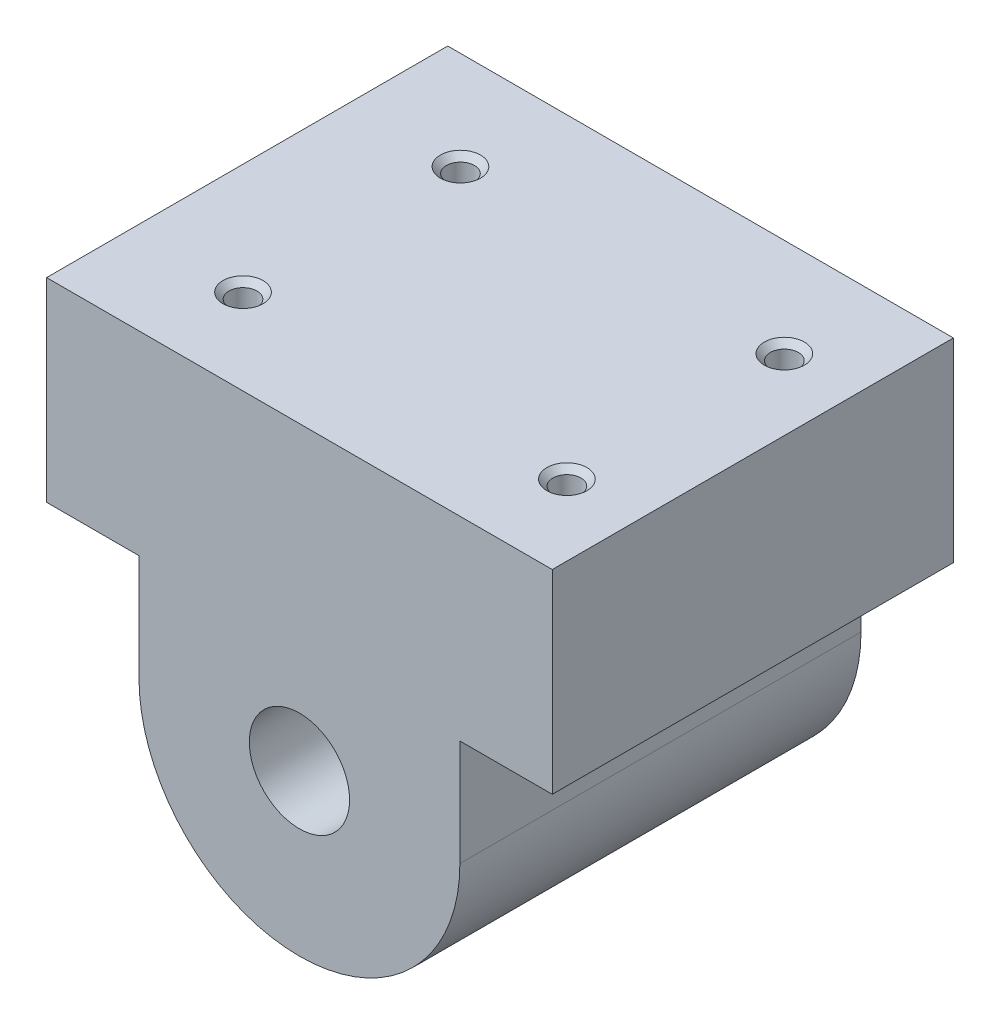
ISO-10303-21;
HEADER;
FILE_DESCRIPTION(('STEP AP214'),'2;1');
FILE_NAME('part.step','',(''),(''),'','','');
FILE_SCHEMA(('AUTOMOTIVE_DESIGN { 1 0 10303 214 1 1 1 1 }'));
ENDSEC;
DATA;
#1=APPLICATION_CONTEXT('core data for automotive mechanical design processes');
#2=APPLICATION_PROTOCOL_DEFINITION('international standard','automotive_design',2000,#1);
#3=PRODUCT_CONTEXT('',#1,'mechanical');
#4=PRODUCT('Part','Part','',(#3));
#5=PRODUCT_RELATED_PRODUCT_CATEGORY('part','',(#4));
#6=PRODUCT_DEFINITION_FORMATION('','',#4);
#7=PRODUCT_DEFINITION_CONTEXT('part definition',#1,'design');
#8=PRODUCT_DEFINITION('design','',#6,#7);
#9=PRODUCT_DEFINITION_SHAPE('','',#8);
#10=(LENGTH_UNIT() NAMED_UNIT(*) SI_UNIT(.MILLI.,.METRE.));
#11=(NAMED_UNIT(*) PLANE_ANGLE_UNIT() SI_UNIT($,.RADIAN.));
#12=(NAMED_UNIT(*) SI_UNIT($,.STERADIAN.) SOLID_ANGLE_UNIT());
#13=UNCERTAINTY_MEASURE_WITH_UNIT(LENGTH_MEASURE(1.E-05),#10,'distance_accuracy_value','');
#14=(GEOMETRIC_REPRESENTATION_CONTEXT(3) GLOBAL_UNCERTAINTY_ASSIGNED_CONTEXT((#13)) GLOBAL_UNIT_ASSIGNED_CONTEXT((#10,
#11,#12)) REPRESENTATION_CONTEXT('',''));
#15=CARTESIAN_POINT('',(0.,0.,0.));
#16=DIRECTION('',(0.,0.,1.));
#17=DIRECTION('',(1.,0.,0.));
#18=AXIS2_PLACEMENT_3D('',#15,#16,#17);
#19=CARTESIAN_POINT('',(-80.0000000362782,150.,-100.));
#20=DIRECTION('',(-1.,0.,0.));
#21=DIRECTION('',(0.,-1.,0.));
#22=AXIS2_PLACEMENT_3D('',#19,#20,#21);
#23=PLANE('',#22);
#24=DIRECTION('',(0.,-1.,0.));
#25=VECTOR('',#24,1.);
#26=CARTESIAN_POINT('',(-80.0000000362782,150.,100.));
#27=LINE('',#26,#25);
#28=CARTESIAN_POINT('',(-80.0000000362782,52.942582361,100.));
#29=VERTEX_POINT('',#28);
#30=CARTESIAN_POINT('',(-80.0000000362782,0.,100.));
#31=VERTEX_POINT('',#30);
#32=EDGE_CURVE('E69',#29,#31,#27,.T.);
#33=ORIENTED_EDGE('',*,*,#32,.F.);
#34=DIRECTION('',(0.,0.,1.));
#35=VECTOR('',#34,1.);
#36=CARTESIAN_POINT('',(-80.0000000362782,52.942582361,100.));
#37=LINE('',#36,#35);
#38=CARTESIAN_POINT('',(-80.0000000362782,52.942582361,-100.));
#39=VERTEX_POINT('',#38);
#40=EDGE_CURVE('E186',#39,#29,#37,.T.);
#41=ORIENTED_EDGE('',*,*,#40,.F.);
#42=DIRECTION('',(0.,-1.,0.));
#43=VECTOR('',#42,1.);
#44=CARTESIAN_POINT('',(-80.0000000362782,150.,-100.));
#45=LINE('',#44,#43);
#46=CARTESIAN_POINT('',(-80.0000000362782,0.,-100.));
#47=VERTEX_POINT('',#46);
#48=EDGE_CURVE('E57',#39,#47,#45,.T.);
#49=ORIENTED_EDGE('',*,*,#48,.T.);
#50=DIRECTION('',(0.,0.,1.));
#51=VECTOR('',#50,1.);
#52=CARTESIAN_POINT('',(-80.0000000362782,0.,-100.));
#53=LINE('',#52,#51);
#54=EDGE_CURVE('E77',#47,#31,#53,.T.);
#55=ORIENTED_EDGE('',*,*,#54,.T.);
#56=EDGE_LOOP('',(#33,#41,#49,#55));
#57=FACE_BOUND('',#56,.T.);
#58=ADVANCED_FACE('F33',(#57),#23,.T.);
#59=CARTESIAN_POINT('',(80.0000000362782,0.,-100.));
#60=DIRECTION('',(1.,0.,0.));
#61=DIRECTION('',(0.,1.,0.));
#62=AXIS2_PLACEMENT_3D('',#59,#60,#61);
#63=PLANE('',#62);
#64=DIRECTION('',(0.,1.,0.));
#65=VECTOR('',#64,1.);
#66=CARTESIAN_POINT('',(80.0000000362782,0.,-100.));
#67=LINE('',#66,#65);
#68=CARTESIAN_POINT('',(80.0000000362782,0.,-100.));
#69=VERTEX_POINT('',#68);
#70=CARTESIAN_POINT('',(80.0000000362782,52.9425823242566,-100.));
#71=VERTEX_POINT('',#70);
#72=EDGE_CURVE('E222',#69,#71,#67,.T.);
#73=ORIENTED_EDGE('',*,*,#72,.T.);
#74=DIRECTION('',(0.,0.,-1.));
#75=VECTOR('',#74,1.);
#76=CARTESIAN_POINT('',(80.0000000362782,52.9425823242566,-100.));
#77=LINE('',#76,#75);
#78=CARTESIAN_POINT('',(80.0000000362782,52.9425823242566,100.));
#79=VERTEX_POINT('',#78);
#80=EDGE_CURVE('E204',#79,#71,#77,.T.);
#81=ORIENTED_EDGE('',*,*,#80,.F.);
#82=DIRECTION('',(0.,1.,0.));
#83=VECTOR('',#82,1.);
#84=CARTESIAN_POINT('',(80.0000000362782,0.,100.));
#85=LINE('',#84,#83);
#86=CARTESIAN_POINT('',(80.0000000362782,0.,100.));
#87=VERTEX_POINT('',#86);
#88=EDGE_CURVE('E86',#87,#79,#85,.T.);
#89=ORIENTED_EDGE('',*,*,#88,.F.);
#90=DIRECTION('',(0.,0.,1.));
#91=VECTOR('',#90,1.);
#92=CARTESIAN_POINT('',(80.0000000362782,0.,-100.));
#93=LINE('',#92,#91);
#94=EDGE_CURVE('E82',#69,#87,#93,.T.);
#95=ORIENTED_EDGE('',*,*,#94,.F.);
#96=EDGE_LOOP('',(#73,#81,#89,#95));
#97=FACE_BOUND('',#96,.T.);
#98=ADVANCED_FACE('F135',(#97),#63,.T.);
#99=CARTESIAN_POINT('',(0.,0.,-100.));
#100=DIRECTION('',(0.,0.,1.));
#101=DIRECTION('',(1.,0.,0.));
#102=AXIS2_PLACEMENT_3D('',#99,#100,#101);
#103=CYLINDRICAL_SURFACE('',#102,80.0000000362782);
#104=CARTESIAN_POINT('',(0.,0.,100.));
#105=DIRECTION('',(0.,0.,1.));
#106=DIRECTION('',(1.,0.,0.));
#107=AXIS2_PLACEMENT_3D('',#104,#105,#106);
#108=CIRCLE('',#107,80.0000000362782);
#109=EDGE_CURVE('E73',#31,#87,#108,.T.);
#110=ORIENTED_EDGE('',*,*,#109,.F.);
#111=ORIENTED_EDGE('',*,*,#54,.F.);
#112=CARTESIAN_POINT('',(0.,0.,-100.));
#113=DIRECTION('',(0.,0.,1.));
#114=DIRECTION('',(1.,0.,0.));
#115=AXIS2_PLACEMENT_3D('',#112,#113,#114);
#116=CIRCLE('',#115,80.0000000362782);
#117=EDGE_CURVE('E74',#47,#69,#116,.T.);
#118=ORIENTED_EDGE('',*,*,#117,.T.);
#119=ORIENTED_EDGE('',*,*,#94,.T.);
#120=EDGE_LOOP('',(#110,#111,#118,#119));
#121=FACE_BOUND('',#120,.T.);
#122=ADVANCED_FACE('F84',(#121),#103,.T.);
#123=CARTESIAN_POINT('',(80.0000000362782,150.,-100.));
#124=DIRECTION('',(0.,1.,0.));
#125=DIRECTION('',(0.,0.,1.));
#126=AXIS2_PLACEMENT_3D('',#123,#124,#125);
#127=PLANE('',#126);
#128=CARTESIAN_POINT('',(90.685157882,150.,-51.091167344));
#129=DIRECTION('',(0.,1.,0.));
#130=DIRECTION('',(0.,0.,1.));
#131=AXIS2_PLACEMENT_3D('',#128,#129,#130);
#132=CIRCLE('',#131,10.);
#133=CARTESIAN_POINT('',(90.685157882,150.,-41.091167344));
#134=VERTEX_POINT('',#133);
#135=EDGE_CURVE('E110',#134,#134,#132,.F.);
#136=ORIENTED_EDGE('',*,*,#135,.T.);
#137=EDGE_LOOP('',(#136));
#138=FACE_BOUND('',#137,.T.);
#139=CARTESIAN_POINT('',(90.685157882,150.,57.320629237));
#140=DIRECTION('',(0.,1.,0.));
#141=DIRECTION('',(0.,0.,1.));
#142=AXIS2_PLACEMENT_3D('',#139,#140,#141);
#143=CIRCLE('',#142,10.);
#144=CARTESIAN_POINT('',(90.685157882,150.,67.320629237));
#145=VERTEX_POINT('',#144);
#146=EDGE_CURVE('E107',#145,#145,#143,.F.);
#147=ORIENTED_EDGE('',*,*,#146,.T.);
#148=EDGE_LOOP('',(#147));
#149=FACE_BOUND('',#148,.T.);
#150=CARTESIAN_POINT('',(-70.811035645,150.,-51.091167344));
#151=DIRECTION('',(0.,1.,0.));
#152=DIRECTION('',(0.,0.,1.));
#153=AXIS2_PLACEMENT_3D('',#150,#151,#152);
#154=CIRCLE('',#153,10.);
#155=CARTESIAN_POINT('',(-70.811035645,150.,-41.091167344));
#156=VERTEX_POINT('',#155);
#157=EDGE_CURVE('E104',#156,#156,#154,.F.);
#158=ORIENTED_EDGE('',*,*,#157,.T.);
#159=EDGE_LOOP('',(#158));
#160=FACE_BOUND('',#159,.T.);
#161=CARTESIAN_POINT('',(-70.811035645,150.,57.320629237));
#162=DIRECTION('',(0.,1.,0.));
#163=DIRECTION('',(0.,0.,1.));
#164=AXIS2_PLACEMENT_3D('',#161,#162,#163);
#165=CIRCLE('',#164,10.);
#166=CARTESIAN_POINT('',(-70.811035645,150.,67.320629237));
#167=VERTEX_POINT('',#166);
#168=EDGE_CURVE('E101',#167,#167,#165,.F.);
#169=ORIENTED_EDGE('',*,*,#168,.T.);
#170=EDGE_LOOP('',(#169));
#171=FACE_BOUND('',#170,.T.);
#172=DIRECTION('',(-1.,0.,0.));
#173=VECTOR('',#172,1.);
#174=CARTESIAN_POINT('',(80.0000000362782,150.,100.));
#175=LINE('',#174,#173);
#176=CARTESIAN_POINT('',(126.061398121278,149.999999980652,100.));
#177=VERTEX_POINT('',#176);
#178=CARTESIAN_POINT('',(-126.061398085,150.,100.));
#179=VERTEX_POINT('',#178);
#180=EDGE_CURVE('E75',#177,#179,#175,.T.);
#181=ORIENTED_EDGE('',*,*,#180,.F.);
#182=DIRECTION('',(0.,0.,1.));
#183=VECTOR('',#182,1.);
#184=CARTESIAN_POINT('',(126.061398121278,149.999999980652,100.));
#185=LINE('',#184,#183);
#186=CARTESIAN_POINT('',(126.061398121278,149.999999980652,-100.));
#187=VERTEX_POINT('',#186);
#188=EDGE_CURVE('E214',#187,#177,#185,.T.);
#189=ORIENTED_EDGE('',*,*,#188,.F.);
#190=DIRECTION('',(-1.,0.,0.));
#191=VECTOR('',#190,1.);
#192=CARTESIAN_POINT('',(80.0000000362782,150.,-100.));
#193=LINE('',#192,#191);
#194=CARTESIAN_POINT('',(-126.061398085,150.,-100.));
#195=VERTEX_POINT('',#194);
#196=EDGE_CURVE('E224',#187,#195,#193,.T.);
#197=ORIENTED_EDGE('',*,*,#196,.T.);
#198=DIRECTION('',(0.,0.,-1.));
#199=VECTOR('',#198,1.);
#200=CARTESIAN_POINT('',(-126.061398085,150.,-100.));
#201=LINE('',#200,#199);
#202=EDGE_CURVE('E190',#179,#195,#201,.T.);
#203=ORIENTED_EDGE('',*,*,#202,.F.);
#204=EDGE_LOOP('',(#181,#189,#197,#203));
#205=FACE_BOUND('',#204,.T.);
#206=ADVANCED_FACE('F145',(#138,#149,#160,#171,#205),#127,.T.);
#207=CARTESIAN_POINT('',(0.,0.,-100.));
#208=DIRECTION('',(0.,0.,1.));
#209=DIRECTION('',(1.,0.,0.));
#210=AXIS2_PLACEMENT_3D('',#207,#208,#209);
#211=PLANE('',#210);
#212=CARTESIAN_POINT('',(0.,0.,-100.));
#213=DIRECTION('',(0.,0.,1.));
#214=DIRECTION('',(1.,0.,0.));
#215=AXIS2_PLACEMENT_3D('',#212,#213,#214);
#216=CIRCLE('',#215,25.);
#217=CARTESIAN_POINT('',(25.,0.,-100.));
#218=VERTEX_POINT('',#217);
#219=EDGE_CURVE('E177',#218,#218,#216,.T.);
#220=ORIENTED_EDGE('',*,*,#219,.T.);
#221=EDGE_LOOP('',(#220));
#222=FACE_BOUND('',#221,.T.);
#223=ORIENTED_EDGE('',*,*,#117,.F.);
#224=ORIENTED_EDGE('',*,*,#48,.F.);
#225=DIRECTION('',(1.,0.,0.));
#226=VECTOR('',#225,1.);
#227=CARTESIAN_POINT('',(-126.061398085,52.942582361,-100.));
#228=LINE('',#227,#226);
#229=CARTESIAN_POINT('',(-126.061398085,52.942582361,-100.));
#230=VERTEX_POINT('',#229);
#231=EDGE_CURVE('E201',#230,#39,#228,.T.);
#232=ORIENTED_EDGE('',*,*,#231,.F.);
#233=DIRECTION('',(0.,-1.,0.));
#234=VECTOR('',#233,1.);
#235=CARTESIAN_POINT('',(-126.061398085,52.942582361,-100.));
#236=LINE('',#235,#234);
#237=EDGE_CURVE('E193',#195,#230,#236,.T.);
#238=ORIENTED_EDGE('',*,*,#237,.F.);
#239=ORIENTED_EDGE('',*,*,#196,.F.);
#240=DIRECTION('',(0.,1.,0.));
#241=VECTOR('',#240,1.);
#242=CARTESIAN_POINT('',(126.061398121278,149.999999980652,-100.));
#243=LINE('',#242,#241);
#244=CARTESIAN_POINT('',(126.061398121278,52.9425823242566,-100.));
#245=VERTEX_POINT('',#244);
#246=EDGE_CURVE('E211',#245,#187,#243,.T.);
#247=ORIENTED_EDGE('',*,*,#246,.F.);
#248=DIRECTION('',(-1.,0.,0.));
#249=VECTOR('',#248,1.);
#250=CARTESIAN_POINT('',(126.061398121278,52.9425823242566,-100.));
#251=LINE('',#250,#249);
#252=EDGE_CURVE('E91',#245,#71,#251,.T.);
#253=ORIENTED_EDGE('',*,*,#252,.T.);
#254=ORIENTED_EDGE('',*,*,#72,.F.);
#255=EDGE_LOOP('',(#223,#224,#232,#238,#239,#247,#253,#254));
#256=FACE_BOUND('',#255,.T.);
#257=ADVANCED_FACE('F147',(#222,#256),#211,.F.);
#258=CARTESIAN_POINT('',(0.,0.,100.));
#259=DIRECTION('',(0.,0.,1.));
#260=DIRECTION('',(1.,0.,0.));
#261=AXIS2_PLACEMENT_3D('',#258,#259,#260);
#262=PLANE('',#261);
#263=CARTESIAN_POINT('',(0.,0.,100.));
#264=DIRECTION('',(0.,0.,1.));
#265=DIRECTION('',(1.,0.,0.));
#266=AXIS2_PLACEMENT_3D('',#263,#264,#265);
#267=CIRCLE('',#266,25.);
#268=CARTESIAN_POINT('',(25.,0.,100.));
#269=VERTEX_POINT('',#268);
#270=EDGE_CURVE('E173',#269,#269,#267,.T.);
#271=ORIENTED_EDGE('',*,*,#270,.F.);
#272=EDGE_LOOP('',(#271));
#273=FACE_BOUND('',#272,.T.);
#274=ORIENTED_EDGE('',*,*,#109,.T.);
#275=ORIENTED_EDGE('',*,*,#88,.T.);
#276=DIRECTION('',(-1.,0.,0.));
#277=VECTOR('',#276,1.);
#278=CARTESIAN_POINT('',(126.061398121278,52.9425823242566,100.));
#279=LINE('',#278,#277);
#280=CARTESIAN_POINT('',(126.061398121278,52.9425823242566,100.));
#281=VERTEX_POINT('',#280);
#282=EDGE_CURVE('E87',#281,#79,#279,.T.);
#283=ORIENTED_EDGE('',*,*,#282,.F.);
#284=DIRECTION('',(0.,-1.,0.));
#285=VECTOR('',#284,1.);
#286=CARTESIAN_POINT('',(126.061398121278,52.9425823242566,100.));
#287=LINE('',#286,#285);
#288=EDGE_CURVE('E205',#177,#281,#287,.T.);
#289=ORIENTED_EDGE('',*,*,#288,.F.);
#290=ORIENTED_EDGE('',*,*,#180,.T.);
#291=DIRECTION('',(0.,1.,0.));
#292=VECTOR('',#291,1.);
#293=CARTESIAN_POINT('',(-126.061398085,150.,100.));
#294=LINE('',#293,#292);
#295=CARTESIAN_POINT('',(-126.061398085,52.942582361,100.));
#296=VERTEX_POINT('',#295);
#297=EDGE_CURVE('E187',#296,#179,#294,.T.);
#298=ORIENTED_EDGE('',*,*,#297,.F.);
#299=DIRECTION('',(1.,0.,0.));
#300=VECTOR('',#299,1.);
#301=CARTESIAN_POINT('',(-126.061398085,52.942582361,100.));
#302=LINE('',#301,#300);
#303=EDGE_CURVE('E48',#296,#29,#302,.T.);
#304=ORIENTED_EDGE('',*,*,#303,.T.);
#305=ORIENTED_EDGE('',*,*,#32,.T.);
#306=EDGE_LOOP('',(#274,#275,#283,#289,#290,#298,#304,#305));
#307=FACE_BOUND('',#306,.T.);
#308=ADVANCED_FACE('F70',(#273,#307),#262,.T.);
#309=CARTESIAN_POINT('',(126.061398121278,52.9425823242566,-100.));
#310=DIRECTION('',(0.,1.,0.));
#311=DIRECTION('',(-1.,0.,0.));
#312=AXIS2_PLACEMENT_3D('',#309,#310,#311);
#313=PLANE('',#312);
#314=ORIENTED_EDGE('',*,*,#80,.T.);
#315=ORIENTED_EDGE('',*,*,#252,.F.);
#316=DIRECTION('',(0.,0.,-1.));
#317=VECTOR('',#316,1.);
#318=CARTESIAN_POINT('',(126.061398121278,52.9425823242566,-100.));
#319=LINE('',#318,#317);
#320=EDGE_CURVE('E208',#281,#245,#319,.T.);
#321=ORIENTED_EDGE('',*,*,#320,.F.);
#322=ORIENTED_EDGE('',*,*,#282,.T.);
#323=EDGE_LOOP('',(#314,#315,#321,#322));
#324=FACE_BOUND('',#323,.T.);
#325=ADVANCED_FACE('F264',(#324),#313,.F.);
#326=CARTESIAN_POINT('',(126.061398121278,0.,0.));
#327=DIRECTION('',(-1.,0.,0.));
#328=DIRECTION('',(0.,-1.,0.));
#329=AXIS2_PLACEMENT_3D('',#326,#327,#328);
#330=PLANE('',#329);
#331=ORIENTED_EDGE('',*,*,#288,.T.);
#332=ORIENTED_EDGE('',*,*,#320,.T.);
#333=ORIENTED_EDGE('',*,*,#246,.T.);
#334=ORIENTED_EDGE('',*,*,#188,.T.);
#335=EDGE_LOOP('',(#331,#332,#333,#334));
#336=FACE_BOUND('',#335,.T.);
#337=ADVANCED_FACE('F269',(#336),#330,.F.);
#338=CARTESIAN_POINT('',(-126.061398085,52.942582361,100.));
#339=DIRECTION('',(0.,1.,0.));
#340=DIRECTION('',(0.,0.,1.));
#341=AXIS2_PLACEMENT_3D('',#338,#339,#340);
#342=PLANE('',#341);
#343=ORIENTED_EDGE('',*,*,#40,.T.);
#344=ORIENTED_EDGE('',*,*,#303,.F.);
#345=DIRECTION('',(0.,0.,1.));
#346=VECTOR('',#345,1.);
#347=CARTESIAN_POINT('',(-126.061398085,52.942582361,100.));
#348=LINE('',#347,#346);
#349=EDGE_CURVE('E196',#230,#296,#348,.T.);
#350=ORIENTED_EDGE('',*,*,#349,.F.);
#351=ORIENTED_EDGE('',*,*,#231,.T.);
#352=EDGE_LOOP('',(#343,#344,#350,#351));
#353=FACE_BOUND('',#352,.T.);
#354=ADVANCED_FACE('F247',(#353),#342,.F.);
#355=CARTESIAN_POINT('',(-126.061398085,0.,0.));
#356=DIRECTION('',(1.,0.,0.));
#357=DIRECTION('',(0.,0.,-1.));
#358=AXIS2_PLACEMENT_3D('',#355,#356,#357);
#359=PLANE('',#358);
#360=ORIENTED_EDGE('',*,*,#297,.T.);
#361=ORIENTED_EDGE('',*,*,#202,.T.);
#362=ORIENTED_EDGE('',*,*,#237,.T.);
#363=ORIENTED_EDGE('',*,*,#349,.T.);
#364=EDGE_LOOP('',(#360,#361,#362,#363));
#365=FACE_BOUND('',#364,.T.);
#366=ADVANCED_FACE('F240',(#365),#359,.F.);
#367=CARTESIAN_POINT('',(0.,0.,100.));
#368=DIRECTION('',(0.,0.,1.));
#369=DIRECTION('',(1.,0.,0.));
#370=AXIS2_PLACEMENT_3D('',#367,#368,#369);
#371=CYLINDRICAL_SURFACE('',#370,25.);
#372=ORIENTED_EDGE('',*,*,#219,.F.);
#373=EDGE_LOOP('',(#372));
#374=FACE_BOUND('',#373,.T.);
#375=ORIENTED_EDGE('',*,*,#270,.T.);
#376=EDGE_LOOP('',(#375));
#377=FACE_BOUND('',#376,.T.);
#378=ADVANCED_FACE('F287',(#374,#377),#371,.F.);
#379=CARTESIAN_POINT('',(90.685157882,120.,-51.091167344));
#380=DIRECTION('',(0.,1.,0.));
#381=DIRECTION('',(0.,0.,1.));
#382=AXIS2_PLACEMENT_3D('',#379,#380,#381);
#383=CONICAL_SURFACE('',#382,6.99999999999999,1.02974425869691);
#384=CARTESIAN_POINT('',(90.685157882,115.793975667,-51.091167344));
#385=VERTEX_POINT('',#384);
#386=VERTEX_LOOP('',#385);
#387=FACE_BOUND('',#386,.T.);
#388=CARTESIAN_POINT('',(90.685157882,120.,-51.091167344));
#389=DIRECTION('',(0.,1.,0.));
#390=DIRECTION('',(0.,0.,1.));
#391=AXIS2_PLACEMENT_3D('',#388,#389,#390);
#392=CIRCLE('',#391,6.99999999999999);
#393=CARTESIAN_POINT('',(90.685157882,120.,-44.091167344));
#394=VERTEX_POINT('',#393);
#395=EDGE_CURVE('E171',#394,#394,#392,.T.);
#396=ORIENTED_EDGE('',*,*,#395,.T.);
#397=EDGE_LOOP('',(#396));
#398=FACE_BOUND('',#397,.T.);
#399=ADVANCED_FACE('F167',(#387,#398),#383,.F.);
#400=CARTESIAN_POINT('',(90.685157882,150.,-51.091167344));
#401=DIRECTION('',(0.,1.,0.));
#402=DIRECTION('',(0.,0.,1.));
#403=AXIS2_PLACEMENT_3D('',#400,#401,#402);
#404=CYLINDRICAL_SURFACE('',#403,7.);
#405=CARTESIAN_POINT('',(90.685157882,147.,-51.091167344));
#406=DIRECTION('',(0.,1.,0.));
#407=DIRECTION('',(0.,0.,1.));
#408=AXIS2_PLACEMENT_3D('',#405,#406,#407);
#409=CIRCLE('',#408,7.);
#410=CARTESIAN_POINT('',(90.685157882,147.,-44.091167344));
#411=VERTEX_POINT('',#410);
#412=EDGE_CURVE('E81',#411,#411,#409,.T.);
#413=ORIENTED_EDGE('',*,*,#412,.T.);
#414=EDGE_LOOP('',(#413));
#415=FACE_BOUND('',#414,.T.);
#416=ORIENTED_EDGE('',*,*,#395,.F.);
#417=EDGE_LOOP('',(#416));
#418=FACE_BOUND('',#417,.T.);
#419=ADVANCED_FACE('F163',(#415,#418),#404,.F.);
#420=CARTESIAN_POINT('',(90.685157882,120.,57.320629237));
#421=DIRECTION('',(0.,1.,0.));
#422=DIRECTION('',(0.,0.,1.));
#423=AXIS2_PLACEMENT_3D('',#420,#421,#422);
#424=CONICAL_SURFACE('',#423,6.99999999999999,1.02974425869691);
#425=CARTESIAN_POINT('',(90.685157882,115.793975667,57.320629237));
#426=VERTEX_POINT('',#425);
#427=VERTEX_LOOP('',#426);
#428=FACE_BOUND('',#427,.T.);
#429=CARTESIAN_POINT('',(90.685157882,120.,57.320629237));
#430=DIRECTION('',(0.,1.,0.));
#431=DIRECTION('',(0.,0.,1.));
#432=AXIS2_PLACEMENT_3D('',#429,#430,#431);
#433=CIRCLE('',#432,6.99999999999999);
#434=CARTESIAN_POINT('',(90.685157882,120.,64.320629237));
#435=VERTEX_POINT('',#434);
#436=EDGE_CURVE('E174',#435,#435,#433,.T.);
#437=ORIENTED_EDGE('',*,*,#436,.T.);
#438=EDGE_LOOP('',(#437));
#439=FACE_BOUND('',#438,.T.);
#440=ADVANCED_FACE('F166',(#428,#439),#424,.F.);
#441=CARTESIAN_POINT('',(90.685157882,150.,57.320629237));
#442=DIRECTION('',(0.,1.,0.));
#443=DIRECTION('',(0.,0.,1.));
#444=AXIS2_PLACEMENT_3D('',#441,#442,#443);
#445=CYLINDRICAL_SURFACE('',#444,7.);
#446=CARTESIAN_POINT('',(90.685157882,147.,57.320629237));
#447=DIRECTION('',(0.,1.,0.));
#448=DIRECTION('',(0.,0.,1.));
#449=AXIS2_PLACEMENT_3D('',#446,#447,#448);
#450=CIRCLE('',#449,7.);
#451=CARTESIAN_POINT('',(90.685157882,147.,64.320629237));
#452=VERTEX_POINT('',#451);
#453=EDGE_CURVE('E113',#452,#452,#450,.T.);
#454=ORIENTED_EDGE('',*,*,#453,.T.);
#455=EDGE_LOOP('',(#454));
#456=FACE_BOUND('',#455,.T.);
#457=ORIENTED_EDGE('',*,*,#436,.F.);
#458=EDGE_LOOP('',(#457));
#459=FACE_BOUND('',#458,.T.);
#460=ADVANCED_FACE('F301',(#456,#459),#445,.F.);
#461=CARTESIAN_POINT('',(-70.811035645,120.,57.320629237));
#462=DIRECTION('',(0.,1.,0.));
#463=DIRECTION('',(0.,0.,1.));
#464=AXIS2_PLACEMENT_3D('',#461,#462,#463);
#465=CONICAL_SURFACE('',#464,6.99999999999999,1.02974425869691);
#466=CARTESIAN_POINT('',(-70.811035645,115.793975667,57.320629237));
#467=VERTEX_POINT('',#466);
#468=VERTEX_LOOP('',#467);
#469=FACE_BOUND('',#468,.T.);
#470=CARTESIAN_POINT('',(-70.811035645,120.,57.320629237));
#471=DIRECTION('',(0.,1.,0.));
#472=DIRECTION('',(0.,0.,1.));
#473=AXIS2_PLACEMENT_3D('',#470,#471,#472);
#474=CIRCLE('',#473,6.99999999999999);
#475=CARTESIAN_POINT('',(-70.811035645,120.,64.320629237));
#476=VERTEX_POINT('',#475);
#477=EDGE_CURVE('E180',#476,#476,#474,.T.);
#478=ORIENTED_EDGE('',*,*,#477,.T.);
#479=EDGE_LOOP('',(#478));
#480=FACE_BOUND('',#479,.T.);
#481=ADVANCED_FACE('F305',(#469,#480),#465,.F.);
#482=CARTESIAN_POINT('',(-70.811035645,150.,57.320629237));
#483=DIRECTION('',(0.,1.,0.));
#484=DIRECTION('',(0.,0.,1.));
#485=AXIS2_PLACEMENT_3D('',#482,#483,#484);
#486=CYLINDRICAL_SURFACE('',#485,7.);
#487=CARTESIAN_POINT('',(-70.811035645,147.,57.320629237));
#488=DIRECTION('',(0.,1.,0.));
#489=DIRECTION('',(0.,0.,1.));
#490=AXIS2_PLACEMENT_3D('',#487,#488,#489);
#491=CIRCLE('',#490,7.);
#492=CARTESIAN_POINT('',(-70.811035645,147.,64.320629237));
#493=VERTEX_POINT('',#492);
#494=EDGE_CURVE('E11',#493,#493,#491,.T.);
#495=ORIENTED_EDGE('',*,*,#494,.T.);
#496=EDGE_LOOP('',(#495));
#497=FACE_BOUND('',#496,.T.);
#498=ORIENTED_EDGE('',*,*,#477,.F.);
#499=EDGE_LOOP('',(#498));
#500=FACE_BOUND('',#499,.T.);
#501=ADVANCED_FACE('F309',(#497,#500),#486,.F.);
#502=CARTESIAN_POINT('',(-70.811035645,120.,-51.091167344));
#503=DIRECTION('',(0.,1.,0.));
#504=DIRECTION('',(0.,0.,1.));
#505=AXIS2_PLACEMENT_3D('',#502,#503,#504);
#506=CONICAL_SURFACE('',#505,6.99999999999999,1.02974425869691);
#507=CARTESIAN_POINT('',(-70.811035645,115.793975667,-51.091167344));
#508=VERTEX_POINT('',#507);
#509=VERTEX_LOOP('',#508);
#510=FACE_BOUND('',#509,.T.);
#511=CARTESIAN_POINT('',(-70.811035645,120.,-51.091167344));
#512=DIRECTION('',(0.,1.,0.));
#513=DIRECTION('',(0.,0.,1.));
#514=AXIS2_PLACEMENT_3D('',#511,#512,#513);
#515=CIRCLE('',#514,6.99999999999999);
#516=CARTESIAN_POINT('',(-70.811035645,120.,-44.091167344));
#517=VERTEX_POINT('',#516);
#518=EDGE_CURVE('E323',#517,#517,#515,.T.);
#519=ORIENTED_EDGE('',*,*,#518,.T.);
#520=EDGE_LOOP('',(#519));
#521=FACE_BOUND('',#520,.T.);
#522=ADVANCED_FACE('F157',(#510,#521),#506,.F.);
#523=CARTESIAN_POINT('',(-70.811035645,150.,-51.091167344));
#524=DIRECTION('',(0.,1.,0.));
#525=DIRECTION('',(0.,0.,1.));
#526=AXIS2_PLACEMENT_3D('',#523,#524,#525);
#527=CYLINDRICAL_SURFACE('',#526,7.);
#528=CARTESIAN_POINT('',(-70.811035645,147.,-51.091167344));
#529=DIRECTION('',(0.,1.,0.));
#530=DIRECTION('',(0.,0.,1.));
#531=AXIS2_PLACEMENT_3D('',#528,#529,#530);
#532=CIRCLE('',#531,7.);
#533=CARTESIAN_POINT('',(-70.811035645,147.,-44.091167344));
#534=VERTEX_POINT('',#533);
#535=EDGE_CURVE('E41',#534,#534,#532,.T.);
#536=ORIENTED_EDGE('',*,*,#535,.T.);
#537=EDGE_LOOP('',(#536));
#538=FACE_BOUND('',#537,.T.);
#539=ORIENTED_EDGE('',*,*,#518,.F.);
#540=EDGE_LOOP('',(#539));
#541=FACE_BOUND('',#540,.T.);
#542=ADVANCED_FACE('F118',(#538,#541),#527,.F.);
#543=CARTESIAN_POINT('',(90.685157882,147.,-51.091167344));
#544=DIRECTION('',(0.,1.,0.));
#545=DIRECTION('',(0.,0.,1.));
#546=AXIS2_PLACEMENT_3D('',#543,#544,#545);
#547=CONICAL_SURFACE('',#546,7.,0.785398163397449);
#548=ORIENTED_EDGE('',*,*,#135,.F.);
#549=EDGE_LOOP('',(#548));
#550=FACE_BOUND('',#549,.T.);
#551=ORIENTED_EDGE('',*,*,#412,.F.);
#552=EDGE_LOOP('',(#551));
#553=FACE_BOUND('',#552,.T.);
#554=ADVANCED_FACE('F130',(#550,#553),#547,.F.);
#555=CARTESIAN_POINT('',(90.685157882,147.,57.320629237));
#556=DIRECTION('',(0.,1.,0.));
#557=DIRECTION('',(0.,0.,1.));
#558=AXIS2_PLACEMENT_3D('',#555,#556,#557);
#559=CONICAL_SURFACE('',#558,7.,0.785398163397449);
#560=ORIENTED_EDGE('',*,*,#146,.F.);
#561=EDGE_LOOP('',(#560));
#562=FACE_BOUND('',#561,.T.);
#563=ORIENTED_EDGE('',*,*,#453,.F.);
#564=EDGE_LOOP('',(#563));
#565=FACE_BOUND('',#564,.T.);
#566=ADVANCED_FACE('F123',(#562,#565),#559,.F.);
#567=CARTESIAN_POINT('',(-70.811035645,147.,-51.091167344));
#568=DIRECTION('',(0.,1.,0.));
#569=DIRECTION('',(0.,0.,1.));
#570=AXIS2_PLACEMENT_3D('',#567,#568,#569);
#571=CONICAL_SURFACE('',#570,7.,0.785398163397449);
#572=ORIENTED_EDGE('',*,*,#157,.F.);
#573=EDGE_LOOP('',(#572));
#574=FACE_BOUND('',#573,.T.);
#575=ORIENTED_EDGE('',*,*,#535,.F.);
#576=EDGE_LOOP('',(#575));
#577=FACE_BOUND('',#576,.T.);
#578=ADVANCED_FACE('F121',(#574,#577),#571,.F.);
#579=CARTESIAN_POINT('',(-70.811035645,147.,57.320629237));
#580=DIRECTION('',(0.,1.,0.));
#581=DIRECTION('',(0.,0.,1.));
#582=AXIS2_PLACEMENT_3D('',#579,#580,#581);
#583=CONICAL_SURFACE('',#582,7.,0.785398163397449);
#584=ORIENTED_EDGE('',*,*,#168,.F.);
#585=EDGE_LOOP('',(#584));
#586=FACE_BOUND('',#585,.T.);
#587=ORIENTED_EDGE('',*,*,#494,.F.);
#588=EDGE_LOOP('',(#587));
#589=FACE_BOUND('',#588,.T.);
#590=ADVANCED_FACE('F35',(#586,#589),#583,.F.);
#591=CLOSED_SHELL('',(#58,#98,#122,#206,#257,#308,#325,#337,#354,#366,#378,#399,#419,#440,#460,
#481,#501,#522,#542,#554,#566,#578,#590));
#592=MANIFOLD_SOLID_BREP('B2',#591);
#593=ADVANCED_BREP_SHAPE_REPRESENTATION('',(#18,#592),#14);
#594=SHAPE_DEFINITION_REPRESENTATION(#9,#593);
ENDSEC;
END-ISO-10303-21;
